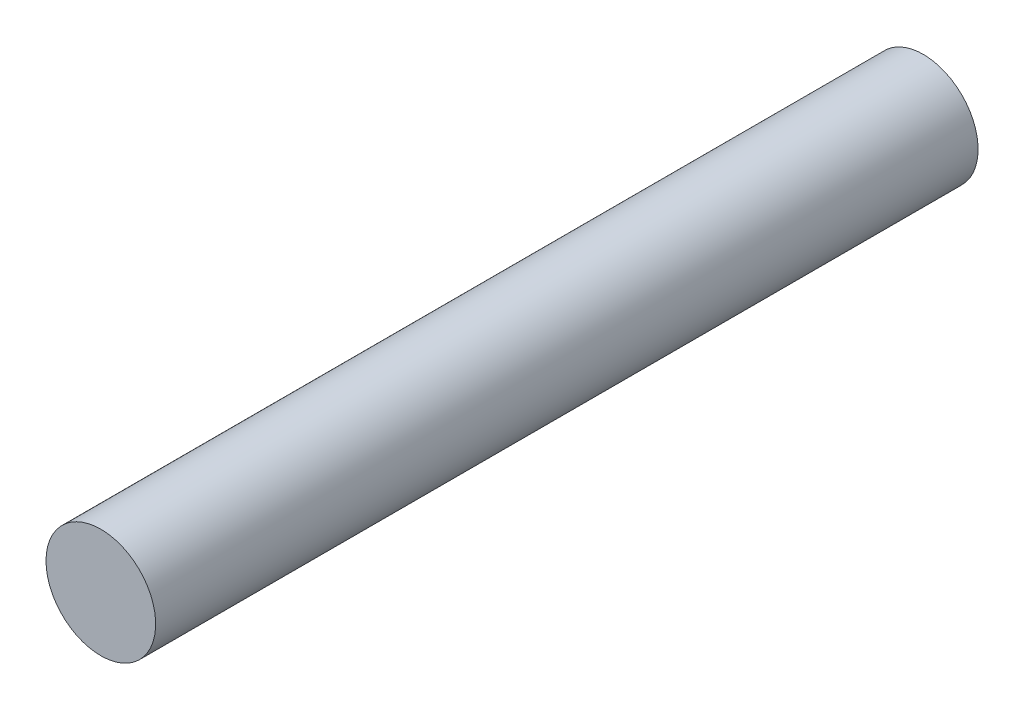
ISO-10303-21;
HEADER;
FILE_DESCRIPTION(('STEP AP214'),'2;1');
FILE_NAME('part.step','',(''),(''),'','','');
FILE_SCHEMA(('AUTOMOTIVE_DESIGN { 1 0 10303 214 1 1 1 1 }'));
ENDSEC;
DATA;
#1=APPLICATION_CONTEXT('core data for automotive mechanical design processes');
#2=APPLICATION_PROTOCOL_DEFINITION('international standard','automotive_design',2000,#1);
#3=PRODUCT_CONTEXT('',#1,'mechanical');
#4=PRODUCT('Part','Part','',(#3));
#5=PRODUCT_RELATED_PRODUCT_CATEGORY('part','',(#4));
#6=PRODUCT_DEFINITION_FORMATION('','',#4);
#7=PRODUCT_DEFINITION_CONTEXT('part definition',#1,'design');
#8=PRODUCT_DEFINITION('design','',#6,#7);
#9=PRODUCT_DEFINITION_SHAPE('','',#8);
#10=(LENGTH_UNIT() NAMED_UNIT(*) SI_UNIT(.MILLI.,.METRE.));
#11=(NAMED_UNIT(*) PLANE_ANGLE_UNIT() SI_UNIT($,.RADIAN.));
#12=(NAMED_UNIT(*) SI_UNIT($,.STERADIAN.) SOLID_ANGLE_UNIT());
#13=UNCERTAINTY_MEASURE_WITH_UNIT(LENGTH_MEASURE(1.E-05),#10,'distance_accuracy_value','');
#14=(GEOMETRIC_REPRESENTATION_CONTEXT(3) GLOBAL_UNCERTAINTY_ASSIGNED_CONTEXT((#13)) GLOBAL_UNIT_ASSIGNED_CONTEXT((#10,
#11,#12)) REPRESENTATION_CONTEXT('',''));
#15=CARTESIAN_POINT('',(0.,0.,0.));
#16=DIRECTION('',(0.,0.,1.));
#17=DIRECTION('',(1.,0.,0.));
#18=AXIS2_PLACEMENT_3D('',#15,#16,#17);
#19=CARTESIAN_POINT('',(0.,0.,22.5));
#20=DIRECTION('',(0.,0.,-1.));
#21=DIRECTION('',(-1.,0.,0.));
#22=AXIS2_PLACEMENT_3D('',#19,#20,#21);
#23=CYLINDRICAL_SURFACE('',#22,3.);
#24=CARTESIAN_POINT('',(0.,0.,22.5));
#25=DIRECTION('',(0.,0.,1.));
#26=DIRECTION('',(1.,0.,0.));
#27=AXIS2_PLACEMENT_3D('',#24,#25,#26);
#28=CIRCLE('',#27,3.);
#29=CARTESIAN_POINT('',(-3.,0.,22.5));
#30=VERTEX_POINT('',#29);
#31=EDGE_CURVE('E10',#30,#30,#28,.T.);
#32=CARTESIAN_POINT('',(0.,0.,-22.5));
#33=DIRECTION('',(0.,0.,1.));
#34=DIRECTION('',(1.,0.,0.));
#35=AXIS2_PLACEMENT_3D('',#32,#33,#34);
#36=CIRCLE('',#35,3.);
#37=CARTESIAN_POINT('',(-3.,0.,-22.5));
#38=VERTEX_POINT('',#37);
#39=EDGE_CURVE('E40',#38,#38,#36,.T.);
#40=CARTESIAN_POINT('',(-3.,0.,22.5));
#41=CARTESIAN_POINT('',(-3.,0.,22.03125));
#42=CARTESIAN_POINT('',(-3.,0.,21.5625));
#43=CARTESIAN_POINT('',(-3.,0.,20.625));
#44=CARTESIAN_POINT('',(-3.,0.,20.15625));
#45=CARTESIAN_POINT('',(-3.,0.,19.21875));
#46=CARTESIAN_POINT('',(-3.,0.,18.75));
#47=CARTESIAN_POINT('',(-3.,0.,17.8125));
#48=CARTESIAN_POINT('',(-3.,0.,17.34375));
#49=CARTESIAN_POINT('',(-3.,0.,16.40625));
#50=CARTESIAN_POINT('',(-3.,0.,15.9375));
#51=CARTESIAN_POINT('',(-3.,0.,15.));
#52=CARTESIAN_POINT('',(-3.,0.,14.53125));
#53=CARTESIAN_POINT('',(-3.,0.,13.59375));
#54=CARTESIAN_POINT('',(-3.,0.,13.125));
#55=CARTESIAN_POINT('',(-3.,0.,12.1875));
#56=CARTESIAN_POINT('',(-3.,0.,11.71875));
#57=CARTESIAN_POINT('',(-3.,0.,10.78125));
#58=CARTESIAN_POINT('',(-3.,0.,10.3125));
#59=CARTESIAN_POINT('',(-3.,0.,9.37499999999999));
#60=CARTESIAN_POINT('',(-3.,0.,8.90625));
#61=CARTESIAN_POINT('',(-3.,0.,7.96874999999999));
#62=CARTESIAN_POINT('',(-3.,0.,7.5));
#63=CARTESIAN_POINT('',(-3.,0.,6.5625));
#64=CARTESIAN_POINT('',(-3.,0.,6.09374999999999));
#65=CARTESIAN_POINT('',(-3.,0.,5.15624999999999));
#66=CARTESIAN_POINT('',(-3.,0.,4.68749999999999));
#67=CARTESIAN_POINT('',(-3.,0.,3.74999999999999));
#68=CARTESIAN_POINT('',(-3.,0.,3.28124999999999));
#69=CARTESIAN_POINT('',(-3.,0.,2.34375));
#70=CARTESIAN_POINT('',(-3.,0.,1.87499999999999));
#71=CARTESIAN_POINT('',(-3.,0.,0.937499999999994));
#72=CARTESIAN_POINT('',(-3.,0.,0.468749999999993));
#73=CARTESIAN_POINT('',(-3.,0.,-0.468750000000007));
#74=CARTESIAN_POINT('',(-3.,0.,-0.937500000000008));
#75=CARTESIAN_POINT('',(-3.,0.,-1.87500000000001));
#76=CARTESIAN_POINT('',(-3.,0.,-2.34375000000001));
#77=CARTESIAN_POINT('',(-3.,0.,-3.28125000000001));
#78=CARTESIAN_POINT('',(-3.,0.,-3.75000000000001));
#79=CARTESIAN_POINT('',(-3.,0.,-4.68750000000001));
#80=CARTESIAN_POINT('',(-3.,0.,-5.15625000000001));
#81=CARTESIAN_POINT('',(-3.,0.,-6.09375000000001));
#82=CARTESIAN_POINT('',(-3.,0.,-6.56250000000001));
#83=CARTESIAN_POINT('',(-3.,0.,-7.50000000000001));
#84=CARTESIAN_POINT('',(-3.,0.,-7.96875000000001));
#85=CARTESIAN_POINT('',(-3.,0.,-8.90625000000001));
#86=CARTESIAN_POINT('',(-3.,0.,-9.37500000000001));
#87=CARTESIAN_POINT('',(-3.,0.,-10.3125));
#88=CARTESIAN_POINT('',(-3.,0.,-10.78125));
#89=CARTESIAN_POINT('',(-3.,0.,-11.71875));
#90=CARTESIAN_POINT('',(-3.,0.,-12.1875));
#91=CARTESIAN_POINT('',(-3.,0.,-13.125));
#92=CARTESIAN_POINT('',(-3.,0.,-13.59375));
#93=CARTESIAN_POINT('',(-3.,0.,-14.53125));
#94=CARTESIAN_POINT('',(-3.,0.,-15.));
#95=CARTESIAN_POINT('',(-3.,0.,-15.9375));
#96=CARTESIAN_POINT('',(-3.,0.,-16.40625));
#97=CARTESIAN_POINT('',(-3.,0.,-17.34375));
#98=CARTESIAN_POINT('',(-3.,0.,-17.8125));
#99=CARTESIAN_POINT('',(-3.,0.,-18.75));
#100=CARTESIAN_POINT('',(-3.,0.,-19.21875));
#101=CARTESIAN_POINT('',(-3.,0.,-20.15625));
#102=CARTESIAN_POINT('',(-3.,0.,-20.625));
#103=CARTESIAN_POINT('',(-3.,0.,-21.5625));
#104=CARTESIAN_POINT('',(-3.,0.,-22.03125));
#105=CARTESIAN_POINT('',(-3.,0.,-22.5));
#106=B_SPLINE_CURVE_WITH_KNOTS('',3,(#40,#41,#42,#43,#44,#45,#46,#47,#48,#49,#50,#51,#52,#53,
#54,#55,#56,#57,#58,#59,#60,#61,#62,#63,#64,#65,#66,#67,#68,#69,#70,#71,#72,#73,#74,#75,#76,#77,
#78,#79,#80,#81,#82,#83,#84,#85,#86,#87,#88,#89,#90,#91,#92,#93,#94,#95,#96,#97,#98,#99,#100,
#101,#102,#103,#104,#105),.UNSPECIFIED.,.F.,.F.,(4,2,2,2,2,2,2,2,2,2,2,2,2,2,2,2,2,2,2,2,2,2,2,
2,2,2,2,2,2,2,2,2,4),(0.,1.40625,2.8125,4.21875,5.625,7.03125,8.4375,9.84375,11.25,12.65625,
14.0625,15.46875,16.875,18.28125,19.6875,21.09375,22.5,23.90625,25.3125,26.71875,28.125,
29.53125,30.9375,32.34375,33.75,35.15625,36.5625,37.96875,39.375,40.78125,42.1875,43.59375,45.),.UNSPECIFIED.);
#107=EDGE_CURVE('BSEAM37',#30,#38,#106,.T.);
#108=ORIENTED_EDGE('',*,*,#31,.F.);
#109=ORIENTED_EDGE('',*,*,#39,.T.);
#110=ORIENTED_EDGE('',*,*,#107,.T.);
#111=ORIENTED_EDGE('',*,*,#107,.F.);
#112=EDGE_LOOP('',(#108,#110,#109,#111));
#113=FACE_BOUND('',#112,.T.);
#114=ADVANCED_FACE('F37',(#113),#23,.T.);
#115=CARTESIAN_POINT('',(0.,0.,22.5));
#116=DIRECTION('',(0.,0.,1.));
#117=DIRECTION('',(1.,0.,0.));
#118=AXIS2_PLACEMENT_3D('',#115,#116,#117);
#119=PLANE('',#118);
#120=ORIENTED_EDGE('',*,*,#31,.T.);
#121=EDGE_LOOP('',(#120));
#122=FACE_BOUND('',#121,.T.);
#123=ADVANCED_FACE('F54',(#122),#119,.T.);
#124=CARTESIAN_POINT('',(0.,0.,-22.5));
#125=DIRECTION('',(0.,0.,1.));
#126=DIRECTION('',(1.,0.,0.));
#127=AXIS2_PLACEMENT_3D('',#124,#125,#126);
#128=PLANE('',#127);
#129=ORIENTED_EDGE('',*,*,#39,.F.);
#130=EDGE_LOOP('',(#129));
#131=FACE_BOUND('',#130,.T.);
#132=ADVANCED_FACE('F52',(#131),#128,.F.);
#133=CLOSED_SHELL('',(#114,#123,#132));
#134=MANIFOLD_SOLID_BREP('B2',#133);
#135=ADVANCED_BREP_SHAPE_REPRESENTATION('',(#18,#134),#14);
#136=SHAPE_DEFINITION_REPRESENTATION(#9,#135);
ENDSEC;
END-ISO-10303-21;
